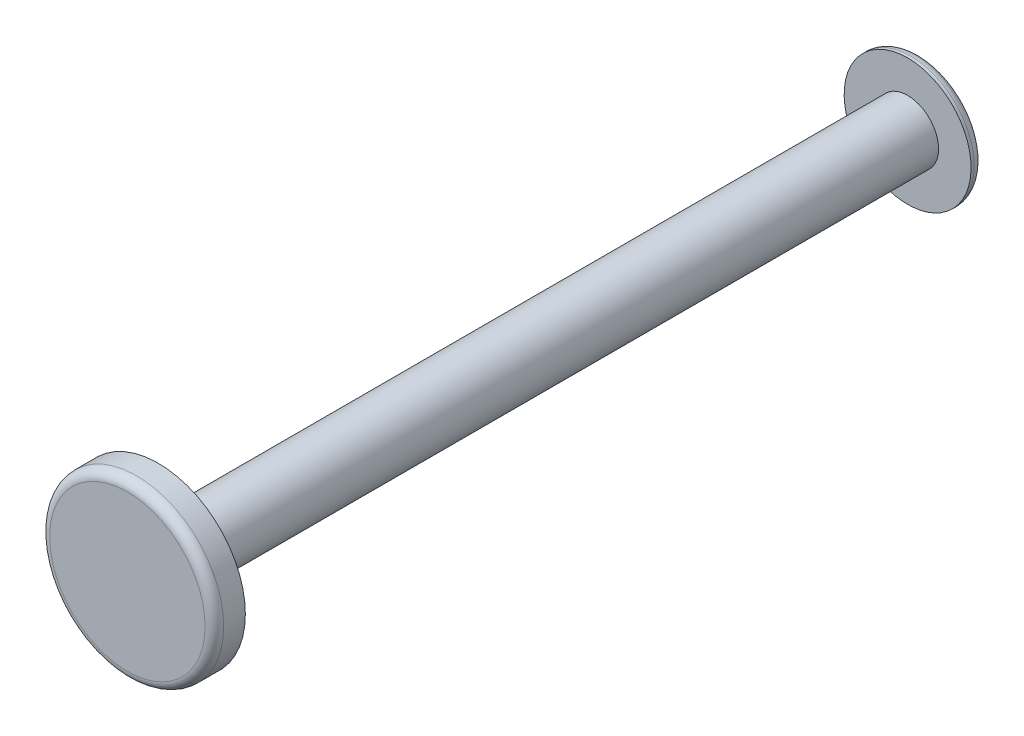
ISO-10303-21;
HEADER;
FILE_DESCRIPTION(('STEP AP214'),'2;1');
FILE_NAME('part.step','',(''),(''),'','','');
FILE_SCHEMA(('AUTOMOTIVE_DESIGN { 1 0 10303 214 1 1 1 1 }'));
ENDSEC;
DATA;
#1=APPLICATION_CONTEXT('core data for automotive mechanical design processes');
#2=APPLICATION_PROTOCOL_DEFINITION('international standard','automotive_design',2000,#1);
#3=PRODUCT_CONTEXT('',#1,'mechanical');
#4=PRODUCT('Part','Part','',(#3));
#5=PRODUCT_RELATED_PRODUCT_CATEGORY('part','',(#4));
#6=PRODUCT_DEFINITION_FORMATION('','',#4);
#7=PRODUCT_DEFINITION_CONTEXT('part definition',#1,'design');
#8=PRODUCT_DEFINITION('design','',#6,#7);
#9=PRODUCT_DEFINITION_SHAPE('','',#8);
#10=(LENGTH_UNIT() NAMED_UNIT(*) SI_UNIT(.MILLI.,.METRE.));
#11=(NAMED_UNIT(*) PLANE_ANGLE_UNIT() SI_UNIT($,.RADIAN.));
#12=(NAMED_UNIT(*) SI_UNIT($,.STERADIAN.) SOLID_ANGLE_UNIT());
#13=UNCERTAINTY_MEASURE_WITH_UNIT(LENGTH_MEASURE(1.E-05),#10,'distance_accuracy_value','');
#14=(GEOMETRIC_REPRESENTATION_CONTEXT(3) GLOBAL_UNCERTAINTY_ASSIGNED_CONTEXT((#13)) GLOBAL_UNIT_ASSIGNED_CONTEXT((#10,
#11,#12)) REPRESENTATION_CONTEXT('',''));
#15=CARTESIAN_POINT('',(0.,0.,0.));
#16=DIRECTION('',(0.,0.,1.));
#17=DIRECTION('',(1.,0.,0.));
#18=AXIS2_PLACEMENT_3D('',#15,#16,#17);
#19=CARTESIAN_POINT('',(-1.83302770289265E-13,17.5,-27.0284271247462));
#20=DIRECTION('',(0.,0.,1.));
#21=DIRECTION('',(1.,0.,0.));
#22=AXIS2_PLACEMENT_3D('',#19,#20,#21);
#23=CYLINDRICAL_SURFACE('',#22,1.);
#24=CARTESIAN_POINT('',(-1.83302770289265E-13,17.5,0.));
#25=DIRECTION('',(0.,0.,1.));
#26=DIRECTION('',(1.,0.,0.));
#27=AXIS2_PLACEMENT_3D('',#24,#25,#26);
#28=CIRCLE('',#27,1.);
#29=CARTESIAN_POINT('',(0.999999999999818,17.5,0.));
#30=VERTEX_POINT('',#29);
#31=EDGE_CURVE('E59',#30,#30,#28,.T.);
#32=ORIENTED_EDGE('',*,*,#31,.F.);
#33=EDGE_LOOP('',(#32));
#34=FACE_BOUND('',#33,.T.);
#35=CARTESIAN_POINT('',(-1.83302770289265E-13,17.5,-24.2));
#36=DIRECTION('',(0.,0.,-1.));
#37=DIRECTION('',(0.,1.,0.));
#38=AXIS2_PLACEMENT_3D('',#35,#36,#37);
#39=CIRCLE('',#38,1.);
#40=CARTESIAN_POINT('',(-1.83302770289265E-13,18.5,-24.2));
#41=VERTEX_POINT('',#40);
#42=EDGE_CURVE('E65',#41,#41,#39,.F.);
#43=ORIENTED_EDGE('',*,*,#42,.T.);
#44=EDGE_LOOP('',(#43));
#45=FACE_BOUND('',#44,.T.);
#46=ADVANCED_FACE('F35',(#34,#45),#23,.T.);
#47=CARTESIAN_POINT('',(-1.83302876458243E-13,17.5,1.));
#48=DIRECTION('',(0.,0.,-1.));
#49=DIRECTION('',(-1.,0.,0.));
#50=AXIS2_PLACEMENT_3D('',#47,#48,#49);
#51=CYLINDRICAL_SURFACE('',#50,2.81);
#52=CARTESIAN_POINT('',(-1.83302876458243E-13,17.5,0.7));
#53=DIRECTION('',(0.,0.,1.));
#54=DIRECTION('',(1.,0.,0.));
#55=AXIS2_PLACEMENT_3D('',#52,#53,#54);
#56=CIRCLE('',#55,2.81);
#57=CARTESIAN_POINT('',(2.80999999999982,17.5,0.7));
#58=VERTEX_POINT('',#57);
#59=EDGE_CURVE('E46',#58,#58,#56,.F.);
#60=ORIENTED_EDGE('',*,*,#59,.T.);
#61=EDGE_LOOP('',(#60));
#62=FACE_BOUND('',#61,.T.);
#63=CARTESIAN_POINT('',(-1.83302876458243E-13,17.5,0.));
#64=DIRECTION('',(0.,0.,1.));
#65=DIRECTION('',(1.,0.,0.));
#66=AXIS2_PLACEMENT_3D('',#63,#64,#65);
#67=CIRCLE('',#66,2.81);
#68=CARTESIAN_POINT('',(2.80999999999982,17.5,0.));
#69=VERTEX_POINT('',#68);
#70=EDGE_CURVE('E62',#69,#69,#67,.T.);
#71=ORIENTED_EDGE('',*,*,#70,.T.);
#72=EDGE_LOOP('',(#71));
#73=FACE_BOUND('',#72,.T.);
#74=ADVANCED_FACE('F89',(#62,#73),#51,.T.);
#75=CARTESIAN_POINT('',(-1.83302876458243E-13,17.5,1.));
#76=DIRECTION('',(0.,0.,1.));
#77=DIRECTION('',(1.,0.,0.));
#78=AXIS2_PLACEMENT_3D('',#75,#76,#77);
#79=PLANE('',#78);
#80=CARTESIAN_POINT('',(-1.83302876458243E-13,17.5,1.));
#81=DIRECTION('',(0.,0.,1.));
#82=DIRECTION('',(1.,0.,0.));
#83=AXIS2_PLACEMENT_3D('',#80,#81,#82);
#84=CIRCLE('',#83,2.51);
#85=CARTESIAN_POINT('',(2.50999999999982,17.5,1.));
#86=VERTEX_POINT('',#85);
#87=EDGE_CURVE('E50',#86,#86,#84,.T.);
#88=ORIENTED_EDGE('',*,*,#87,.T.);
#89=EDGE_LOOP('',(#88));
#90=FACE_BOUND('',#89,.T.);
#91=ADVANCED_FACE('F95',(#90),#79,.T.);
#92=CARTESIAN_POINT('',(-1.83302876458243E-13,17.5,0.));
#93=DIRECTION('',(0.,0.,1.));
#94=DIRECTION('',(1.,0.,0.));
#95=AXIS2_PLACEMENT_3D('',#92,#93,#94);
#96=PLANE('',#95);
#97=ORIENTED_EDGE('',*,*,#31,.T.);
#98=EDGE_LOOP('',(#97));
#99=FACE_BOUND('',#98,.T.);
#100=ORIENTED_EDGE('',*,*,#70,.F.);
#101=EDGE_LOOP('',(#100));
#102=FACE_BOUND('',#101,.T.);
#103=ADVANCED_FACE('F103',(#99,#102),#96,.F.);
#104=CARTESIAN_POINT('',(-1.83302876458243E-13,17.5,0.7));
#105=DIRECTION('',(0.,0.,1.));
#106=DIRECTION('',(1.,0.,0.));
#107=AXIS2_PLACEMENT_3D('',#104,#105,#106);
#108=TOROIDAL_SURFACE('',#107,2.51,0.3);
#109=ORIENTED_EDGE('',*,*,#59,.F.);
#110=EDGE_LOOP('',(#109));
#111=FACE_BOUND('',#110,.T.);
#112=ORIENTED_EDGE('',*,*,#87,.F.);
#113=EDGE_LOOP('',(#112));
#114=FACE_BOUND('',#113,.T.);
#115=ADVANCED_FACE('F101',(#111,#114),#108,.T.);
#116=CARTESIAN_POINT('',(-1.83942104411702E-13,17.5,-24.6));
#117=DIRECTION('',(0.,0.,1.));
#118=DIRECTION('',(0.,-1.,0.));
#119=AXIS2_PLACEMENT_3D('',#116,#117,#118);
#120=CYLINDRICAL_SURFACE('',#119,2.05);
#121=CARTESIAN_POINT('',(-1.83956936297422E-13,17.5,-24.3));
#122=DIRECTION('',(0.,0.,-1.));
#123=DIRECTION('',(0.,1.,0.));
#124=AXIS2_PLACEMENT_3D('',#121,#122,#123);
#125=CIRCLE('',#124,2.05);
#126=CARTESIAN_POINT('',(-1.83956936297422E-13,19.55,-24.3));
#127=VERTEX_POINT('',#126);
#128=EDGE_CURVE('E10',#127,#127,#125,.F.);
#129=ORIENTED_EDGE('',*,*,#128,.T.);
#130=EDGE_LOOP('',(#129));
#131=FACE_BOUND('',#130,.T.);
#132=CARTESIAN_POINT('',(-1.83961880259328E-13,17.5,-24.2));
#133=DIRECTION('',(0.,0.,-1.));
#134=DIRECTION('',(0.,1.,0.));
#135=AXIS2_PLACEMENT_3D('',#132,#133,#134);
#136=CIRCLE('',#135,2.05);
#137=CARTESIAN_POINT('',(-1.83961880259328E-13,19.55,-24.2));
#138=VERTEX_POINT('',#137);
#139=EDGE_CURVE('E55',#138,#138,#136,.T.);
#140=ORIENTED_EDGE('',*,*,#139,.T.);
#141=EDGE_LOOP('',(#140));
#142=FACE_BOUND('',#141,.T.);
#143=ADVANCED_FACE('F71',(#131,#142),#120,.T.);
#144=CARTESIAN_POINT('',(-1.83942104411702E-13,17.5,-24.6));
#145=DIRECTION('',(0.,0.,-1.));
#146=DIRECTION('',(0.,1.,0.));
#147=AXIS2_PLACEMENT_3D('',#144,#145,#146);
#148=PLANE('',#147);
#149=CARTESIAN_POINT('',(-1.83942104411702E-13,17.5,-24.6));
#150=DIRECTION('',(0.,0.,-1.));
#151=DIRECTION('',(0.,1.,0.));
#152=AXIS2_PLACEMENT_3D('',#149,#150,#151);
#153=CIRCLE('',#152,1.75);
#154=CARTESIAN_POINT('',(-1.83942104411702E-13,19.25,-24.6));
#155=VERTEX_POINT('',#154);
#156=EDGE_CURVE('E42',#155,#155,#153,.T.);
#157=ORIENTED_EDGE('',*,*,#156,.T.);
#158=EDGE_LOOP('',(#157));
#159=FACE_BOUND('',#158,.T.);
#160=CARTESIAN_POINT('',(-1.80730610840626E-13,17.5,-24.6));
#161=DIRECTION('',(0.,0.,-1.));
#162=DIRECTION('',(0.,1.,0.));
#163=AXIS2_PLACEMENT_3D('',#160,#161,#162);
#164=CIRCLE('',#163,1.);
#165=CARTESIAN_POINT('',(-1.80730610840626E-13,18.5,-24.6));
#166=VERTEX_POINT('',#165);
#167=EDGE_CURVE('E53',#166,#166,#164,.T.);
#168=ORIENTED_EDGE('',*,*,#167,.F.);
#169=EDGE_LOOP('',(#168));
#170=FACE_BOUND('',#169,.T.);
#171=ADVANCED_FACE('F76',(#159,#170),#148,.T.);
#172=CARTESIAN_POINT('',(-1.83961880259328E-13,17.5,-24.2));
#173=DIRECTION('',(0.,0.,-1.));
#174=DIRECTION('',(0.,1.,0.));
#175=AXIS2_PLACEMENT_3D('',#172,#173,#174);
#176=PLANE('',#175);
#177=ORIENTED_EDGE('',*,*,#42,.F.);
#178=EDGE_LOOP('',(#177));
#179=FACE_BOUND('',#178,.T.);
#180=ORIENTED_EDGE('',*,*,#139,.F.);
#181=EDGE_LOOP('',(#180));
#182=FACE_BOUND('',#181,.T.);
#183=ADVANCED_FACE('F73',(#179,#182),#176,.F.);
#184=CARTESIAN_POINT('',(-1.80730610840626E-13,17.5,-24.6));
#185=DIRECTION('',(0.918394914549332,0.395664985726466,0.));
#186=DIRECTION('',(-0.395664985726466,0.918394914549332,0.));
#187=AXIS2_PLACEMENT_3D('',#184,#185,#186);
#188=SPHERICAL_SURFACE('',#187,1.);
#189=CARTESIAN_POINT('',(-1.80730610840626E-13,17.5,-24.6));
#190=DIRECTION('',(0.,0.,-1.));
#191=DIRECTION('',(0.,1.,0.));
#192=AXIS2_PLACEMENT_3D('',#189,#190,#191);
#193=SPHERICAL_SURFACE('',#192,1.);
#194=ORIENTED_EDGE('',*,*,#167,.T.);
#195=EDGE_LOOP('',(#194));
#196=FACE_BOUND('',#195,.T.);
#197=ADVANCED_FACE('F75',(#196),#193,.F.);
#198=CARTESIAN_POINT('',(-1.83956936297422E-13,17.5,-24.3));
#199=DIRECTION('',(0.,0.,-1.));
#200=DIRECTION('',(0.,1.,0.));
#201=AXIS2_PLACEMENT_3D('',#198,#199,#200);
#202=TOROIDAL_SURFACE('',#201,1.75,0.3);
#203=ORIENTED_EDGE('',*,*,#128,.F.);
#204=EDGE_LOOP('',(#203));
#205=FACE_BOUND('',#204,.T.);
#206=ORIENTED_EDGE('',*,*,#156,.F.);
#207=EDGE_LOOP('',(#206));
#208=FACE_BOUND('',#207,.T.);
#209=ADVANCED_FACE('F37',(#205,#208),#202,.T.);
#210=CLOSED_SHELL('',(#46,#74,#91,#103,#115,#143,#171,#183,#197,#209));
#211=MANIFOLD_SOLID_BREP('B2',#210);
#212=ADVANCED_BREP_SHAPE_REPRESENTATION('',(#18,#211),#14);
#213=SHAPE_DEFINITION_REPRESENTATION(#9,#212);
ENDSEC;
END-ISO-10303-21;
